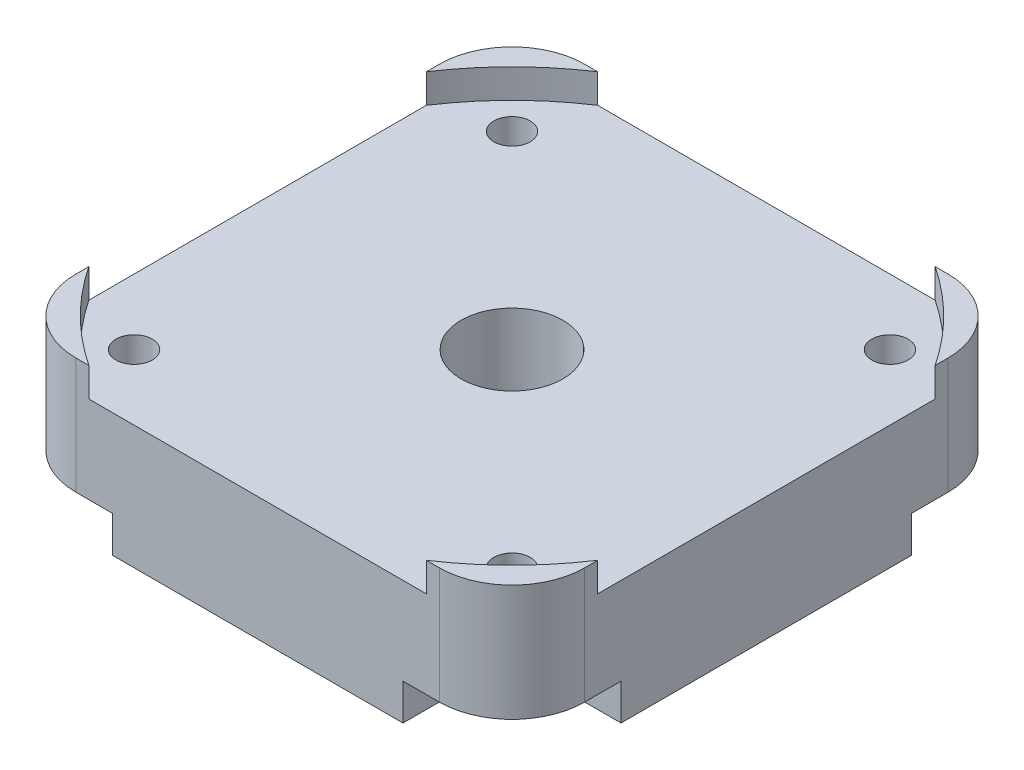
ISO-10303-21;
HEADER;
FILE_DESCRIPTION(('STEP AP214'),'2;1');
FILE_NAME('part.step','',(''),(''),'','','');
FILE_SCHEMA(('AUTOMOTIVE_DESIGN { 1 0 10303 214 1 1 1 1 }'));
ENDSEC;
DATA;
#1=APPLICATION_CONTEXT('core data for automotive mechanical design processes');
#2=APPLICATION_PROTOCOL_DEFINITION('international standard','automotive_design',2000,#1);
#3=PRODUCT_CONTEXT('',#1,'mechanical');
#4=PRODUCT('Part','Part','',(#3));
#5=PRODUCT_RELATED_PRODUCT_CATEGORY('part','',(#4));
#6=PRODUCT_DEFINITION_FORMATION('','',#4);
#7=PRODUCT_DEFINITION_CONTEXT('part definition',#1,'design');
#8=PRODUCT_DEFINITION('design','',#6,#7);
#9=PRODUCT_DEFINITION_SHAPE('','',#8);
#10=(LENGTH_UNIT() NAMED_UNIT(*) SI_UNIT(.MILLI.,.METRE.));
#11=(NAMED_UNIT(*) PLANE_ANGLE_UNIT() SI_UNIT($,.RADIAN.));
#12=(NAMED_UNIT(*) SI_UNIT($,.STERADIAN.) SOLID_ANGLE_UNIT());
#13=UNCERTAINTY_MEASURE_WITH_UNIT(LENGTH_MEASURE(1.E-05),#10,'distance_accuracy_value','');
#14=(GEOMETRIC_REPRESENTATION_CONTEXT(3) GLOBAL_UNCERTAINTY_ASSIGNED_CONTEXT((#13)) GLOBAL_UNIT_ASSIGNED_CONTEXT((#10,
#11,#12)) REPRESENTATION_CONTEXT('',''));
#15=CARTESIAN_POINT('',(0.,0.,0.));
#16=DIRECTION('',(0.,0.,1.));
#17=DIRECTION('',(1.,0.,0.));
#18=AXIS2_PLACEMENT_3D('',#15,#16,#17);
#19=CARTESIAN_POINT('',(0.,0.,0.));
#20=DIRECTION('',(0.,1.,0.));
#21=DIRECTION('',(1.,0.,0.));
#22=AXIS2_PLACEMENT_3D('',#19,#20,#21);
#23=PLANE('',#22);
#24=DIRECTION('',(1.,0.,0.));
#25=VECTOR('',#24,1.);
#26=CARTESIAN_POINT('',(-10.,0.,17.5));
#27=LINE('',#26,#25);
#28=CARTESIAN_POINT('',(-10.,0.,17.5));
#29=VERTEX_POINT('',#28);
#30=CARTESIAN_POINT('',(10.,0.,17.5));
#31=VERTEX_POINT('',#30);
#32=EDGE_CURVE('E35',#29,#31,#27,.T.);
#33=ORIENTED_EDGE('',*,*,#32,.F.);
#34=DIRECTION('',(0.,0.,-1.));
#35=VECTOR('',#34,1.);
#36=CARTESIAN_POINT('',(-10.,0.,17.5));
#37=LINE('',#36,#35);
#38=CARTESIAN_POINT('',(-10.,0.,10.));
#39=VERTEX_POINT('',#38);
#40=EDGE_CURVE('E11',#29,#39,#37,.T.);
#41=ORIENTED_EDGE('',*,*,#40,.T.);
#42=DIRECTION('',(1.,0.,0.));
#43=VECTOR('',#42,1.);
#44=CARTESIAN_POINT('',(-17.5,0.,10.));
#45=LINE('',#44,#43);
#46=CARTESIAN_POINT('',(-17.5,0.,10.));
#47=VERTEX_POINT('',#46);
#48=EDGE_CURVE('E304',#47,#39,#45,.T.);
#49=ORIENTED_EDGE('',*,*,#48,.F.);
#50=DIRECTION('',(0.,0.,1.));
#51=VECTOR('',#50,1.);
#52=CARTESIAN_POINT('',(-17.5,0.,-10.));
#53=LINE('',#52,#51);
#54=CARTESIAN_POINT('',(-17.5,0.,-10.));
#55=VERTEX_POINT('',#54);
#56=EDGE_CURVE('E327',#55,#47,#53,.T.);
#57=ORIENTED_EDGE('',*,*,#56,.F.);
#58=DIRECTION('',(1.,0.,0.));
#59=VECTOR('',#58,1.);
#60=CARTESIAN_POINT('',(-17.5,0.,-10.));
#61=LINE('',#60,#59);
#62=CARTESIAN_POINT('',(-10.,0.,-10.));
#63=VERTEX_POINT('',#62);
#64=EDGE_CURVE('E27',#55,#63,#61,.T.);
#65=ORIENTED_EDGE('',*,*,#64,.T.);
#66=DIRECTION('',(0.,0.,1.));
#67=VECTOR('',#66,1.);
#68=CARTESIAN_POINT('',(-10.,0.,-17.5));
#69=LINE('',#68,#67);
#70=CARTESIAN_POINT('',(-10.,0.,-17.5));
#71=VERTEX_POINT('',#70);
#72=EDGE_CURVE('E255',#71,#63,#69,.T.);
#73=ORIENTED_EDGE('',*,*,#72,.F.);
#74=DIRECTION('',(-1.,0.,0.));
#75=VECTOR('',#74,1.);
#76=CARTESIAN_POINT('',(10.,0.,-17.5));
#77=LINE('',#76,#75);
#78=CARTESIAN_POINT('',(10.,0.,-17.5));
#79=VERTEX_POINT('',#78);
#80=EDGE_CURVE('E258',#79,#71,#77,.T.);
#81=ORIENTED_EDGE('',*,*,#80,.F.);
#82=DIRECTION('',(0.,0.,1.));
#83=VECTOR('',#82,1.);
#84=CARTESIAN_POINT('',(10.,0.,-17.5));
#85=LINE('',#84,#83);
#86=CARTESIAN_POINT('',(10.,0.,-10.));
#87=VERTEX_POINT('',#86);
#88=EDGE_CURVE('E445',#79,#87,#85,.T.);
#89=ORIENTED_EDGE('',*,*,#88,.T.);
#90=DIRECTION('',(-1.,0.,0.));
#91=VECTOR('',#90,1.);
#92=CARTESIAN_POINT('',(17.5,0.,-10.));
#93=LINE('',#92,#91);
#94=CARTESIAN_POINT('',(17.5,0.,-10.));
#95=VERTEX_POINT('',#94);
#96=EDGE_CURVE('E249',#95,#87,#93,.T.);
#97=ORIENTED_EDGE('',*,*,#96,.F.);
#98=DIRECTION('',(0.,0.,-1.));
#99=VECTOR('',#98,1.);
#100=CARTESIAN_POINT('',(17.5,0.,10.));
#101=LINE('',#100,#99);
#102=CARTESIAN_POINT('',(17.5,0.,10.));
#103=VERTEX_POINT('',#102);
#104=EDGE_CURVE('E244',#103,#95,#101,.T.);
#105=ORIENTED_EDGE('',*,*,#104,.F.);
#106=DIRECTION('',(-1.,0.,0.));
#107=VECTOR('',#106,1.);
#108=CARTESIAN_POINT('',(17.5,0.,10.));
#109=LINE('',#108,#107);
#110=CARTESIAN_POINT('',(10.,0.,10.));
#111=VERTEX_POINT('',#110);
#112=EDGE_CURVE('E441',#103,#111,#109,.T.);
#113=ORIENTED_EDGE('',*,*,#112,.T.);
#114=DIRECTION('',(0.,0.,-1.));
#115=VECTOR('',#114,1.);
#116=CARTESIAN_POINT('',(10.,0.,17.5));
#117=LINE('',#116,#115);
#118=EDGE_CURVE('E428',#31,#111,#117,.T.);
#119=ORIENTED_EDGE('',*,*,#118,.F.);
#120=EDGE_LOOP('',(#33,#41,#49,#57,#65,#73,#81,#89,#97,#105,#113,#119));
#121=FACE_BOUND('',#120,.T.);
#122=CARTESIAN_POINT('',(0.,0.,0.));
#123=DIRECTION('',(0.,1.,0.));
#124=DIRECTION('',(1.,0.,0.));
#125=AXIS2_PLACEMENT_3D('',#122,#123,#124);
#126=CIRCLE('',#125,3.5);
#127=CARTESIAN_POINT('',(3.5,0.,0.));
#128=VERTEX_POINT('',#127);
#129=EDGE_CURVE('E438',#128,#128,#126,.T.);
#130=ORIENTED_EDGE('',*,*,#129,.T.);
#131=EDGE_LOOP('',(#130));
#132=FACE_BOUND('',#131,.T.);
#133=ADVANCED_FACE('F17',(#121,#132),#23,.F.);
#134=CARTESIAN_POINT('',(10.,0.,17.5));
#135=DIRECTION('',(-1.,0.,0.));
#136=DIRECTION('',(0.,0.,-1.));
#137=AXIS2_PLACEMENT_3D('',#134,#135,#136);
#138=PLANE('',#137);
#139=DIRECTION('',(0.,1.,0.));
#140=VECTOR('',#139,1.);
#141=CARTESIAN_POINT('',(10.,0.,10.));
#142=LINE('',#141,#140);
#143=CARTESIAN_POINT('',(10.,2.5,10.));
#144=VERTEX_POINT('',#143);
#145=EDGE_CURVE('E435',#111,#144,#142,.T.);
#146=ORIENTED_EDGE('',*,*,#145,.T.);
#147=DIRECTION('',(0.,0.,-1.));
#148=VECTOR('',#147,1.);
#149=CARTESIAN_POINT('',(10.,2.5,17.5));
#150=LINE('',#149,#148);
#151=CARTESIAN_POINT('',(10.,2.5,17.5));
#152=VERTEX_POINT('',#151);
#153=EDGE_CURVE('E411',#152,#144,#150,.T.);
#154=ORIENTED_EDGE('',*,*,#153,.F.);
#155=DIRECTION('',(0.,1.,0.));
#156=VECTOR('',#155,1.);
#157=CARTESIAN_POINT('',(10.,0.,17.5));
#158=LINE('',#157,#156);
#159=EDGE_CURVE('E431',#31,#152,#158,.T.);
#160=ORIENTED_EDGE('',*,*,#159,.F.);
#161=ORIENTED_EDGE('',*,*,#118,.T.);
#162=EDGE_LOOP('',(#146,#154,#160,#161));
#163=FACE_BOUND('',#162,.T.);
#164=ADVANCED_FACE('F468',(#163),#138,.F.);
#165=CARTESIAN_POINT('',(-17.5,0.,17.5));
#166=DIRECTION('',(0.,0.,1.));
#167=DIRECTION('',(1.,0.,0.));
#168=AXIS2_PLACEMENT_3D('',#165,#166,#167);
#169=PLANE('',#168);
#170=DIRECTION('',(0.,-1.,0.));
#171=VECTOR('',#170,1.);
#172=CARTESIAN_POINT('',(12.5,10.5,17.5));
#173=LINE('',#172,#171);
#174=CARTESIAN_POINT('',(12.5,10.5,17.5));
#175=VERTEX_POINT('',#174);
#176=CARTESIAN_POINT('',(12.5,2.5,17.5));
#177=VERTEX_POINT('',#176);
#178=EDGE_CURVE('E394',#175,#177,#173,.T.);
#179=ORIENTED_EDGE('',*,*,#178,.F.);
#180=DIRECTION('',(1.,0.,0.));
#181=VECTOR('',#180,1.);
#182=CARTESIAN_POINT('',(11.60818676624,10.5,17.5));
#183=LINE('',#182,#181);
#184=CARTESIAN_POINT('',(11.60818676624,10.5,17.5));
#185=VERTEX_POINT('',#184);
#186=EDGE_CURVE('E371',#185,#175,#183,.T.);
#187=ORIENTED_EDGE('',*,*,#186,.F.);
#188=DIRECTION('',(0.,-1.,0.));
#189=VECTOR('',#188,1.);
#190=CARTESIAN_POINT('',(11.60818676624,10.5,17.5));
#191=LINE('',#190,#189);
#192=CARTESIAN_POINT('',(11.60818676624,8.5,17.5));
#193=VERTEX_POINT('',#192);
#194=EDGE_CURVE('E421',#185,#193,#191,.T.);
#195=ORIENTED_EDGE('',*,*,#194,.T.);
#196=DIRECTION('',(1.,0.,0.));
#197=VECTOR('',#196,1.);
#198=CARTESIAN_POINT('',(-11.60818676624,8.5,17.5));
#199=LINE('',#198,#197);
#200=CARTESIAN_POINT('',(-11.60818676624,8.5,17.5));
#201=VERTEX_POINT('',#200);
#202=EDGE_CURVE('E295',#201,#193,#199,.T.);
#203=ORIENTED_EDGE('',*,*,#202,.F.);
#204=DIRECTION('',(0.,-1.,0.));
#205=VECTOR('',#204,1.);
#206=CARTESIAN_POINT('',(-11.60818676624,10.5,17.5));
#207=LINE('',#206,#205);
#208=CARTESIAN_POINT('',(-11.60818676624,10.5,17.5));
#209=VERTEX_POINT('',#208);
#210=EDGE_CURVE('E298',#209,#201,#207,.T.);
#211=ORIENTED_EDGE('',*,*,#210,.F.);
#212=DIRECTION('',(1.,0.,0.));
#213=VECTOR('',#212,1.);
#214=CARTESIAN_POINT('',(-12.5,10.5,17.5));
#215=LINE('',#214,#213);
#216=CARTESIAN_POINT('',(-12.5,10.5,17.5));
#217=VERTEX_POINT('',#216);
#218=EDGE_CURVE('E366',#217,#209,#215,.T.);
#219=ORIENTED_EDGE('',*,*,#218,.F.);
#220=DIRECTION('',(0.,-1.,0.));
#221=VECTOR('',#220,1.);
#222=CARTESIAN_POINT('',(-12.5,10.5,17.5));
#223=LINE('',#222,#221);
#224=CARTESIAN_POINT('',(-12.5,2.5,17.5));
#225=VERTEX_POINT('',#224);
#226=EDGE_CURVE('E418',#217,#225,#223,.T.);
#227=ORIENTED_EDGE('',*,*,#226,.T.);
#228=DIRECTION('',(1.,0.,0.));
#229=VECTOR('',#228,1.);
#230=CARTESIAN_POINT('',(-12.5,2.5,17.5));
#231=LINE('',#230,#229);
#232=CARTESIAN_POINT('',(-10.,2.5,17.5));
#233=VERTEX_POINT('',#232);
#234=EDGE_CURVE('E415',#225,#233,#231,.T.);
#235=ORIENTED_EDGE('',*,*,#234,.T.);
#236=DIRECTION('',(0.,1.,0.));
#237=VECTOR('',#236,1.);
#238=CARTESIAN_POINT('',(-10.,0.,17.5));
#239=LINE('',#238,#237);
#240=EDGE_CURVE('E308',#29,#233,#239,.T.);
#241=ORIENTED_EDGE('',*,*,#240,.F.);
#242=ORIENTED_EDGE('',*,*,#32,.T.);
#243=ORIENTED_EDGE('',*,*,#159,.T.);
#244=DIRECTION('',(-1.,0.,0.));
#245=VECTOR('',#244,1.);
#246=CARTESIAN_POINT('',(12.5,2.5,17.5));
#247=LINE('',#246,#245);
#248=EDGE_CURVE('E403',#177,#152,#247,.T.);
#249=ORIENTED_EDGE('',*,*,#248,.F.);
#250=EDGE_LOOP('',(#179,#187,#195,#203,#211,#219,#227,#235,#241,#242,#243,#249));
#251=FACE_BOUND('',#250,.T.);
#252=ADVANCED_FACE('F461',(#251),#169,.T.);
#253=CARTESIAN_POINT('',(0.,2.5,0.));
#254=DIRECTION('',(0.,-1.,0.));
#255=DIRECTION('',(0.,0.,-1.));
#256=AXIS2_PLACEMENT_3D('',#253,#254,#255);
#257=PLANE('',#256);
#258=ORIENTED_EDGE('',*,*,#153,.T.);
#259=DIRECTION('',(1.,0.,0.));
#260=VECTOR('',#259,1.);
#261=CARTESIAN_POINT('',(10.,2.5,10.));
#262=LINE('',#261,#260);
#263=CARTESIAN_POINT('',(17.5,2.5,10.));
#264=VERTEX_POINT('',#263);
#265=EDGE_CURVE('E407',#144,#264,#262,.T.);
#266=ORIENTED_EDGE('',*,*,#265,.T.);
#267=DIRECTION('',(0.,0.,-1.));
#268=VECTOR('',#267,1.);
#269=CARTESIAN_POINT('',(17.5,2.5,12.5));
#270=LINE('',#269,#268);
#271=CARTESIAN_POINT('',(17.5,2.5,12.5));
#272=VERTEX_POINT('',#271);
#273=EDGE_CURVE('E235',#272,#264,#270,.T.);
#274=ORIENTED_EDGE('',*,*,#273,.F.);
#275=CARTESIAN_POINT('',(12.5,2.5,12.5));
#276=DIRECTION('',(0.,-1.,0.));
#277=DIRECTION('',(1.,0.,0.));
#278=AXIS2_PLACEMENT_3D('',#275,#276,#277);
#279=CIRCLE('',#278,5.);
#280=EDGE_CURVE('E404',#272,#177,#279,.T.);
#281=ORIENTED_EDGE('',*,*,#280,.T.);
#282=ORIENTED_EDGE('',*,*,#248,.T.);
#283=EDGE_LOOP('',(#258,#266,#274,#281,#282));
#284=FACE_BOUND('',#283,.T.);
#285=CARTESIAN_POINT('',(13.,2.5,13.));
#286=DIRECTION('',(0.,1.,0.));
#287=DIRECTION('',(-1.,0.,0.));
#288=AXIS2_PLACEMENT_3D('',#285,#286,#287);
#289=CIRCLE('',#288,1.25);
#290=CARTESIAN_POINT('',(11.75,2.5,13.));
#291=VERTEX_POINT('',#290);
#292=EDGE_CURVE('E400',#291,#291,#289,.T.);
#293=ORIENTED_EDGE('',*,*,#292,.T.);
#294=EDGE_LOOP('',(#293));
#295=FACE_BOUND('',#294,.T.);
#296=ADVANCED_FACE('F471',(#284,#295),#257,.T.);
#297=CARTESIAN_POINT('',(12.5,24.1878,12.5));
#298=DIRECTION('',(0.,-1.,0.));
#299=DIRECTION('',(1.,0.,0.));
#300=AXIS2_PLACEMENT_3D('',#297,#298,#299);
#301=CYLINDRICAL_SURFACE('',#300,5.);
#302=DIRECTION('',(0.,-1.,0.));
#303=VECTOR('',#302,1.);
#304=CARTESIAN_POINT('',(17.5,10.5,12.5));
#305=LINE('',#304,#303);
#306=CARTESIAN_POINT('',(17.5,10.5,12.5));
#307=VERTEX_POINT('',#306);
#308=EDGE_CURVE('E267',#307,#272,#305,.T.);
#309=ORIENTED_EDGE('',*,*,#308,.F.);
#310=CARTESIAN_POINT('',(12.5,10.5,12.5));
#311=DIRECTION('',(0.,1.,0.));
#312=DIRECTION('',(0.,0.,1.));
#313=AXIS2_PLACEMENT_3D('',#310,#311,#312);
#314=CIRCLE('',#313,5.);
#315=EDGE_CURVE('E395',#175,#307,#314,.T.);
#316=ORIENTED_EDGE('',*,*,#315,.F.);
#317=ORIENTED_EDGE('',*,*,#178,.T.);
#318=ORIENTED_EDGE('',*,*,#280,.F.);
#319=EDGE_LOOP('',(#309,#316,#317,#318));
#320=FACE_BOUND('',#319,.T.);
#321=ADVANCED_FACE('F477',(#320),#301,.T.);
#322=CARTESIAN_POINT('',(0.,10.5,0.));
#323=DIRECTION('',(0.,1.,0.));
#324=DIRECTION('',(1.,0.,0.));
#325=AXIS2_PLACEMENT_3D('',#322,#323,#324);
#326=PLANE('',#325);
#327=DIRECTION('',(0.,0.,1.));
#328=VECTOR('',#327,1.);
#329=CARTESIAN_POINT('',(-17.5,10.5,-12.5));
#330=LINE('',#329,#328);
#331=CARTESIAN_POINT('',(-17.5,10.5,-12.5));
#332=VERTEX_POINT('',#331);
#333=CARTESIAN_POINT('',(-17.5,10.5,-11.60818676624));
#334=VERTEX_POINT('',#333);
#335=EDGE_CURVE('E391',#332,#334,#330,.T.);
#336=ORIENTED_EDGE('',*,*,#335,.T.);
#337=CARTESIAN_POINT('',(0.,10.5,0.));
#338=DIRECTION('',(0.,-1.,0.));
#339=DIRECTION('',(-0.833333333333308,0.,-0.552770798392605));
#340=AXIS2_PLACEMENT_3D('',#337,#338,#339);
#341=CIRCLE('',#340,21.);
#342=CARTESIAN_POINT('',(-11.60818676624,10.5,-17.5));
#343=VERTEX_POINT('',#342);
#344=EDGE_CURVE('E388',#334,#343,#341,.T.);
#345=ORIENTED_EDGE('',*,*,#344,.T.);
#346=DIRECTION('',(-1.,0.,0.));
#347=VECTOR('',#346,1.);
#348=CARTESIAN_POINT('',(-11.60818676624,10.5,-17.5));
#349=LINE('',#348,#347);
#350=CARTESIAN_POINT('',(-12.5,10.5,-17.5));
#351=VERTEX_POINT('',#350);
#352=EDGE_CURVE('E385',#343,#351,#349,.T.);
#353=ORIENTED_EDGE('',*,*,#352,.T.);
#354=CARTESIAN_POINT('',(-12.5,10.5,-12.5));
#355=DIRECTION('',(0.,1.,0.));
#356=DIRECTION('',(0.,0.,-1.));
#357=AXIS2_PLACEMENT_3D('',#354,#355,#356);
#358=CIRCLE('',#357,5.);
#359=EDGE_CURVE('E383',#351,#332,#358,.T.);
#360=ORIENTED_EDGE('',*,*,#359,.T.);
#361=EDGE_LOOP('',(#336,#345,#353,#360));
#362=FACE_BOUND('',#361,.T.);
#363=ADVANCED_FACE('F542',(#362),#326,.T.);
#364=CARTESIAN_POINT('',(0.,10.5,0.));
#365=DIRECTION('',(0.,1.,0.));
#366=DIRECTION('',(1.,0.,0.));
#367=AXIS2_PLACEMENT_3D('',#364,#365,#366);
#368=PLANE('',#367);
#369=DIRECTION('',(-1.,0.,0.));
#370=VECTOR('',#369,1.);
#371=CARTESIAN_POINT('',(12.5,10.5,-17.5));
#372=LINE('',#371,#370);
#373=CARTESIAN_POINT('',(12.5,10.5,-17.5));
#374=VERTEX_POINT('',#373);
#375=CARTESIAN_POINT('',(11.60818676624,10.5,-17.5));
#376=VERTEX_POINT('',#375);
#377=EDGE_CURVE('E380',#374,#376,#372,.T.);
#378=ORIENTED_EDGE('',*,*,#377,.T.);
#379=CARTESIAN_POINT('',(0.,10.5,0.));
#380=DIRECTION('',(0.,-1.,0.));
#381=DIRECTION('',(0.552770798392605,0.,-0.833333333333308));
#382=AXIS2_PLACEMENT_3D('',#379,#380,#381);
#383=CIRCLE('',#382,21.);
#384=CARTESIAN_POINT('',(17.5,10.5,-11.60818676624));
#385=VERTEX_POINT('',#384);
#386=EDGE_CURVE('E377',#376,#385,#383,.T.);
#387=ORIENTED_EDGE('',*,*,#386,.T.);
#388=DIRECTION('',(0.,0.,-1.));
#389=VECTOR('',#388,1.);
#390=CARTESIAN_POINT('',(17.5,10.5,-11.60818676624));
#391=LINE('',#390,#389);
#392=CARTESIAN_POINT('',(17.5,10.5,-12.5));
#393=VERTEX_POINT('',#392);
#394=EDGE_CURVE('E375',#385,#393,#391,.T.);
#395=ORIENTED_EDGE('',*,*,#394,.T.);
#396=CARTESIAN_POINT('',(12.5,10.5,-12.5));
#397=DIRECTION('',(0.,1.,0.));
#398=DIRECTION('',(1.,0.,0.));
#399=AXIS2_PLACEMENT_3D('',#396,#397,#398);
#400=CIRCLE('',#399,5.);
#401=EDGE_CURVE('E220',#393,#374,#400,.T.);
#402=ORIENTED_EDGE('',*,*,#401,.T.);
#403=EDGE_LOOP('',(#378,#387,#395,#402));
#404=FACE_BOUND('',#403,.T.);
#405=ADVANCED_FACE('F545',(#404),#368,.T.);
#406=CARTESIAN_POINT('',(0.,10.5,0.));
#407=DIRECTION('',(0.,1.,0.));
#408=DIRECTION('',(1.,0.,0.));
#409=AXIS2_PLACEMENT_3D('',#406,#407,#408);
#410=PLANE('',#409);
#411=DIRECTION('',(0.,0.,-1.));
#412=VECTOR('',#411,1.);
#413=CARTESIAN_POINT('',(17.5,10.5,12.5));
#414=LINE('',#413,#412);
#415=CARTESIAN_POINT('',(17.5,10.5,11.60818676624));
#416=VERTEX_POINT('',#415);
#417=EDGE_CURVE('E370',#307,#416,#414,.T.);
#418=ORIENTED_EDGE('',*,*,#417,.T.);
#419=CARTESIAN_POINT('',(0.,10.5,0.));
#420=DIRECTION('',(0.,-1.,0.));
#421=DIRECTION('',(0.833333333333308,0.,0.552770798392605));
#422=AXIS2_PLACEMENT_3D('',#419,#420,#421);
#423=CIRCLE('',#422,21.);
#424=EDGE_CURVE('E367',#416,#185,#423,.T.);
#425=ORIENTED_EDGE('',*,*,#424,.T.);
#426=ORIENTED_EDGE('',*,*,#186,.T.);
#427=ORIENTED_EDGE('',*,*,#315,.T.);
#428=EDGE_LOOP('',(#418,#425,#426,#427));
#429=FACE_BOUND('',#428,.T.);
#430=ADVANCED_FACE('F480',(#429),#410,.T.);
#431=CARTESIAN_POINT('',(0.,10.5,0.));
#432=DIRECTION('',(0.,1.,0.));
#433=DIRECTION('',(1.,0.,0.));
#434=AXIS2_PLACEMENT_3D('',#431,#432,#433);
#435=PLANE('',#434);
#436=ORIENTED_EDGE('',*,*,#218,.T.);
#437=CARTESIAN_POINT('',(0.,10.5,0.));
#438=DIRECTION('',(0.,-1.,0.));
#439=DIRECTION('',(-0.552770798392605,0.,0.833333333333308));
#440=AXIS2_PLACEMENT_3D('',#437,#438,#439);
#441=CIRCLE('',#440,21.);
#442=CARTESIAN_POINT('',(-17.5,10.5,11.60818676624));
#443=VERTEX_POINT('',#442);
#444=EDGE_CURVE('E363',#209,#443,#441,.T.);
#445=ORIENTED_EDGE('',*,*,#444,.T.);
#446=DIRECTION('',(0.,0.,1.));
#447=VECTOR('',#446,1.);
#448=CARTESIAN_POINT('',(-17.5,10.5,11.60818676624));
#449=LINE('',#448,#447);
#450=CARTESIAN_POINT('',(-17.5,10.5,12.5));
#451=VERTEX_POINT('',#450);
#452=EDGE_CURVE('E360',#443,#451,#449,.T.);
#453=ORIENTED_EDGE('',*,*,#452,.T.);
#454=CARTESIAN_POINT('',(-12.5,10.5,12.5));
#455=DIRECTION('',(0.,1.,0.));
#456=DIRECTION('',(-1.,0.,0.));
#457=AXIS2_PLACEMENT_3D('',#454,#455,#456);
#458=CIRCLE('',#457,5.);
#459=EDGE_CURVE('E356',#451,#217,#458,.T.);
#460=ORIENTED_EDGE('',*,*,#459,.T.);
#461=EDGE_LOOP('',(#436,#445,#453,#460));
#462=FACE_BOUND('',#461,.T.);
#463=ADVANCED_FACE('F497',(#462),#435,.T.);
#464=CARTESIAN_POINT('',(-12.5,24.1878,-12.5));
#465=DIRECTION('',(0.,-1.,0.));
#466=DIRECTION('',(-1.,0.,0.));
#467=AXIS2_PLACEMENT_3D('',#464,#465,#466);
#468=CYLINDRICAL_SURFACE('',#467,5.);
#469=DIRECTION('',(0.,-1.,0.));
#470=VECTOR('',#469,1.);
#471=CARTESIAN_POINT('',(-17.5,10.5,-12.5));
#472=LINE('',#471,#470);
#473=CARTESIAN_POINT('',(-17.5,2.5,-12.5));
#474=VERTEX_POINT('',#473);
#475=EDGE_CURVE('E336',#332,#474,#472,.T.);
#476=ORIENTED_EDGE('',*,*,#475,.F.);
#477=ORIENTED_EDGE('',*,*,#359,.F.);
#478=DIRECTION('',(0.,-1.,0.));
#479=VECTOR('',#478,1.);
#480=CARTESIAN_POINT('',(-12.5,10.5,-17.5));
#481=LINE('',#480,#479);
#482=CARTESIAN_POINT('',(-12.5,2.5,-17.5));
#483=VERTEX_POINT('',#482);
#484=EDGE_CURVE('E353',#351,#483,#481,.T.);
#485=ORIENTED_EDGE('',*,*,#484,.T.);
#486=CARTESIAN_POINT('',(-12.5,2.5,-12.5));
#487=DIRECTION('',(0.,-1.,0.));
#488=DIRECTION('',(-1.,0.,0.));
#489=AXIS2_PLACEMENT_3D('',#486,#487,#488);
#490=CIRCLE('',#489,5.);
#491=EDGE_CURVE('E351',#474,#483,#490,.T.);
#492=ORIENTED_EDGE('',*,*,#491,.F.);
#493=EDGE_LOOP('',(#476,#477,#485,#492));
#494=FACE_BOUND('',#493,.T.);
#495=ADVANCED_FACE('F554',(#494),#468,.T.);
#496=CARTESIAN_POINT('',(0.,2.5,0.));
#497=DIRECTION('',(0.,-1.,0.));
#498=DIRECTION('',(0.,0.,1.));
#499=AXIS2_PLACEMENT_3D('',#496,#497,#498);
#500=PLANE('',#499);
#501=ORIENTED_EDGE('',*,*,#491,.T.);
#502=DIRECTION('',(1.,0.,0.));
#503=VECTOR('',#502,1.);
#504=CARTESIAN_POINT('',(-12.5,2.5,-17.5));
#505=LINE('',#504,#503);
#506=CARTESIAN_POINT('',(-10.,2.5,-17.5));
#507=VERTEX_POINT('',#506);
#508=EDGE_CURVE('E348',#483,#507,#505,.T.);
#509=ORIENTED_EDGE('',*,*,#508,.T.);
#510=DIRECTION('',(0.,0.,1.));
#511=VECTOR('',#510,1.);
#512=CARTESIAN_POINT('',(-10.,2.5,-17.5));
#513=LINE('',#512,#511);
#514=CARTESIAN_POINT('',(-10.,2.5,-10.));
#515=VERTEX_POINT('',#514);
#516=EDGE_CURVE('E345',#507,#515,#513,.T.);
#517=ORIENTED_EDGE('',*,*,#516,.T.);
#518=DIRECTION('',(-1.,0.,0.));
#519=VECTOR('',#518,1.);
#520=CARTESIAN_POINT('',(-10.,2.5,-10.));
#521=LINE('',#520,#519);
#522=CARTESIAN_POINT('',(-17.5,2.5,-10.));
#523=VERTEX_POINT('',#522);
#524=EDGE_CURVE('E340',#515,#523,#521,.T.);
#525=ORIENTED_EDGE('',*,*,#524,.T.);
#526=DIRECTION('',(0.,0.,1.));
#527=VECTOR('',#526,1.);
#528=CARTESIAN_POINT('',(-17.5,2.5,-12.5));
#529=LINE('',#528,#527);
#530=EDGE_CURVE('E341',#474,#523,#529,.T.);
#531=ORIENTED_EDGE('',*,*,#530,.F.);
#532=EDGE_LOOP('',(#501,#509,#517,#525,#531));
#533=FACE_BOUND('',#532,.T.);
#534=CARTESIAN_POINT('',(-13.,2.5,-13.));
#535=DIRECTION('',(0.,1.,0.));
#536=DIRECTION('',(1.,0.,0.));
#537=AXIS2_PLACEMENT_3D('',#534,#535,#536);
#538=CIRCLE('',#537,1.25);
#539=CARTESIAN_POINT('',(-11.75,2.5,-13.));
#540=VERTEX_POINT('',#539);
#541=EDGE_CURVE('E335',#540,#540,#538,.T.);
#542=ORIENTED_EDGE('',*,*,#541,.T.);
#543=EDGE_LOOP('',(#542));
#544=FACE_BOUND('',#543,.T.);
#545=ADVANCED_FACE('F557',(#533,#544),#500,.T.);
#546=CARTESIAN_POINT('',(-17.5,0.,-17.5));
#547=DIRECTION('',(-1.,0.,0.));
#548=DIRECTION('',(0.,0.,1.));
#549=AXIS2_PLACEMENT_3D('',#546,#547,#548);
#550=PLANE('',#549);
#551=DIRECTION('',(0.,-1.,0.));
#552=VECTOR('',#551,1.);
#553=CARTESIAN_POINT('',(-17.5,10.5,12.5));
#554=LINE('',#553,#552);
#555=CARTESIAN_POINT('',(-17.5,2.5,12.5));
#556=VERTEX_POINT('',#555);
#557=EDGE_CURVE('E313',#451,#556,#554,.T.);
#558=ORIENTED_EDGE('',*,*,#557,.F.);
#559=ORIENTED_EDGE('',*,*,#452,.F.);
#560=DIRECTION('',(0.,-1.,0.));
#561=VECTOR('',#560,1.);
#562=CARTESIAN_POINT('',(-17.5,10.5,11.60818676624));
#563=LINE('',#562,#561);
#564=CARTESIAN_POINT('',(-17.5,8.5,11.60818676624));
#565=VERTEX_POINT('',#564);
#566=EDGE_CURVE('E332',#443,#565,#563,.T.);
#567=ORIENTED_EDGE('',*,*,#566,.T.);
#568=DIRECTION('',(0.,0.,1.));
#569=VECTOR('',#568,1.);
#570=CARTESIAN_POINT('',(-17.5,8.5,-11.60818676624));
#571=LINE('',#570,#569);
#572=CARTESIAN_POINT('',(-17.5,8.5,-11.60818676624));
#573=VERTEX_POINT('',#572);
#574=EDGE_CURVE('E291',#573,#565,#571,.T.);
#575=ORIENTED_EDGE('',*,*,#574,.F.);
#576=DIRECTION('',(0.,-1.,0.));
#577=VECTOR('',#576,1.);
#578=CARTESIAN_POINT('',(-17.5,10.5,-11.60818676624));
#579=LINE('',#578,#577);
#580=EDGE_CURVE('E286',#334,#573,#579,.T.);
#581=ORIENTED_EDGE('',*,*,#580,.F.);
#582=ORIENTED_EDGE('',*,*,#335,.F.);
#583=ORIENTED_EDGE('',*,*,#475,.T.);
#584=ORIENTED_EDGE('',*,*,#530,.T.);
#585=DIRECTION('',(0.,1.,0.));
#586=VECTOR('',#585,1.);
#587=CARTESIAN_POINT('',(-17.5,0.,-10.));
#588=LINE('',#587,#586);
#589=EDGE_CURVE('E260',#55,#523,#588,.T.);
#590=ORIENTED_EDGE('',*,*,#589,.F.);
#591=ORIENTED_EDGE('',*,*,#56,.T.);
#592=DIRECTION('',(0.,1.,0.));
#593=VECTOR('',#592,1.);
#594=CARTESIAN_POINT('',(-17.5,0.,10.));
#595=LINE('',#594,#593);
#596=CARTESIAN_POINT('',(-17.5,2.5,10.));
#597=VERTEX_POINT('',#596);
#598=EDGE_CURVE('E323',#47,#597,#595,.T.);
#599=ORIENTED_EDGE('',*,*,#598,.T.);
#600=DIRECTION('',(0.,0.,-1.));
#601=VECTOR('',#600,1.);
#602=CARTESIAN_POINT('',(-17.5,2.5,12.5));
#603=LINE('',#602,#601);
#604=EDGE_CURVE('E312',#556,#597,#603,.T.);
#605=ORIENTED_EDGE('',*,*,#604,.F.);
#606=EDGE_LOOP('',(#558,#559,#567,#575,#581,#582,#583,#584,#590,#591,#599,#605));
#607=FACE_BOUND('',#606,.T.);
#608=ADVANCED_FACE('F516',(#607),#550,.T.);
#609=CARTESIAN_POINT('',(0.,2.5,0.));
#610=DIRECTION('',(0.,-1.,0.));
#611=DIRECTION('',(1.,0.,0.));
#612=AXIS2_PLACEMENT_3D('',#609,#610,#611);
#613=PLANE('',#612);
#614=DIRECTION('',(1.,0.,0.));
#615=VECTOR('',#614,1.);
#616=CARTESIAN_POINT('',(-17.5,2.5,10.));
#617=LINE('',#616,#615);
#618=CARTESIAN_POINT('',(-10.,2.5,10.));
#619=VERTEX_POINT('',#618);
#620=EDGE_CURVE('E320',#597,#619,#617,.T.);
#621=ORIENTED_EDGE('',*,*,#620,.T.);
#622=DIRECTION('',(0.,0.,1.));
#623=VECTOR('',#622,1.);
#624=CARTESIAN_POINT('',(-10.,2.5,10.));
#625=LINE('',#624,#623);
#626=EDGE_CURVE('E317',#619,#233,#625,.T.);
#627=ORIENTED_EDGE('',*,*,#626,.T.);
#628=ORIENTED_EDGE('',*,*,#234,.F.);
#629=CARTESIAN_POINT('',(-12.5,2.5,12.5));
#630=DIRECTION('',(0.,-1.,0.));
#631=DIRECTION('',(0.,0.,1.));
#632=AXIS2_PLACEMENT_3D('',#629,#630,#631);
#633=CIRCLE('',#632,5.);
#634=EDGE_CURVE('E314',#225,#556,#633,.T.);
#635=ORIENTED_EDGE('',*,*,#634,.T.);
#636=ORIENTED_EDGE('',*,*,#604,.T.);
#637=EDGE_LOOP('',(#621,#627,#628,#635,#636));
#638=FACE_BOUND('',#637,.T.);
#639=CARTESIAN_POINT('',(-13.,2.5,13.));
#640=DIRECTION('',(0.,1.,0.));
#641=DIRECTION('',(0.,0.,-1.));
#642=AXIS2_PLACEMENT_3D('',#639,#640,#641);
#643=CIRCLE('',#642,1.25);
#644=CARTESIAN_POINT('',(-13.,2.5,11.75));
#645=VERTEX_POINT('',#644);
#646=EDGE_CURVE('E309',#645,#645,#643,.T.);
#647=ORIENTED_EDGE('',*,*,#646,.T.);
#648=EDGE_LOOP('',(#647));
#649=FACE_BOUND('',#648,.T.);
#650=ADVANCED_FACE('F505',(#638,#649),#613,.T.);
#651=CARTESIAN_POINT('',(-12.5,24.1878,12.5));
#652=DIRECTION('',(0.,-1.,0.));
#653=DIRECTION('',(0.,0.,1.));
#654=AXIS2_PLACEMENT_3D('',#651,#652,#653);
#655=CYLINDRICAL_SURFACE('',#654,5.);
#656=ORIENTED_EDGE('',*,*,#226,.F.);
#657=ORIENTED_EDGE('',*,*,#459,.F.);
#658=ORIENTED_EDGE('',*,*,#557,.T.);
#659=ORIENTED_EDGE('',*,*,#634,.F.);
#660=EDGE_LOOP('',(#656,#657,#658,#659));
#661=FACE_BOUND('',#660,.T.);
#662=ADVANCED_FACE('F502',(#661),#655,.T.);
#663=CARTESIAN_POINT('',(-10.,0.,10.));
#664=DIRECTION('',(1.,0.,0.));
#665=DIRECTION('',(0.,0.,1.));
#666=AXIS2_PLACEMENT_3D('',#663,#664,#665);
#667=PLANE('',#666);
#668=ORIENTED_EDGE('',*,*,#240,.T.);
#669=ORIENTED_EDGE('',*,*,#626,.F.);
#670=DIRECTION('',(0.,1.,0.));
#671=VECTOR('',#670,1.);
#672=CARTESIAN_POINT('',(-10.,0.,10.));
#673=LINE('',#672,#671);
#674=EDGE_CURVE('E305',#39,#619,#673,.T.);
#675=ORIENTED_EDGE('',*,*,#674,.F.);
#676=ORIENTED_EDGE('',*,*,#40,.F.);
#677=EDGE_LOOP('',(#668,#669,#675,#676));
#678=FACE_BOUND('',#677,.T.);
#679=ADVANCED_FACE('F510',(#678),#667,.F.);
#680=CARTESIAN_POINT('',(-17.5,0.,10.));
#681=DIRECTION('',(0.,0.,-1.));
#682=DIRECTION('',(1.,0.,0.));
#683=AXIS2_PLACEMENT_3D('',#680,#681,#682);
#684=PLANE('',#683);
#685=ORIENTED_EDGE('',*,*,#674,.T.);
#686=ORIENTED_EDGE('',*,*,#620,.F.);
#687=ORIENTED_EDGE('',*,*,#598,.F.);
#688=ORIENTED_EDGE('',*,*,#48,.T.);
#689=EDGE_LOOP('',(#685,#686,#687,#688));
#690=FACE_BOUND('',#689,.T.);
#691=ADVANCED_FACE('F517',(#690),#684,.F.);
#692=CARTESIAN_POINT('',(-13.,0.,13.));
#693=DIRECTION('',(0.,1.,0.));
#694=DIRECTION('',(0.,0.,1.));
#695=AXIS2_PLACEMENT_3D('',#692,#693,#694);
#696=CYLINDRICAL_SURFACE('',#695,1.25);
#697=CARTESIAN_POINT('',(-13.,8.5,13.));
#698=DIRECTION('',(0.,1.,0.));
#699=DIRECTION('',(0.,0.,1.));
#700=AXIS2_PLACEMENT_3D('',#697,#698,#699);
#701=CIRCLE('',#700,1.25);
#702=CARTESIAN_POINT('',(-13.,8.5,14.25));
#703=VERTEX_POINT('',#702);
#704=EDGE_CURVE('E301',#703,#703,#701,.T.);
#705=ORIENTED_EDGE('',*,*,#704,.T.);
#706=EDGE_LOOP('',(#705));
#707=FACE_BOUND('',#706,.T.);
#708=ORIENTED_EDGE('',*,*,#646,.F.);
#709=EDGE_LOOP('',(#708));
#710=FACE_BOUND('',#709,.T.);
#711=ADVANCED_FACE('F519',(#707,#710),#696,.F.);
#712=CARTESIAN_POINT('',(0.,8.5,0.));
#713=DIRECTION('',(0.,-1.,0.));
#714=DIRECTION('',(1.,0.,0.));
#715=AXIS2_PLACEMENT_3D('',#712,#713,#714);
#716=PLANE('',#715);
#717=CARTESIAN_POINT('',(0.,8.5,0.));
#718=DIRECTION('',(0.,-1.,0.));
#719=DIRECTION('',(-0.552770798392605,0.,0.833333333333308));
#720=AXIS2_PLACEMENT_3D('',#717,#718,#719);
#721=CIRCLE('',#720,21.);
#722=EDGE_CURVE('E222',#201,#565,#721,.T.);
#723=ORIENTED_EDGE('',*,*,#722,.F.);
#724=ORIENTED_EDGE('',*,*,#202,.T.);
#725=CARTESIAN_POINT('',(0.,8.5,0.));
#726=DIRECTION('',(0.,-1.,0.));
#727=DIRECTION('',(0.833333333333308,0.,0.552770798392605));
#728=AXIS2_PLACEMENT_3D('',#725,#726,#727);
#729=CIRCLE('',#728,21.);
#730=CARTESIAN_POINT('',(17.5,8.5,11.60818676624));
#731=VERTEX_POINT('',#730);
#732=EDGE_CURVE('E236',#731,#193,#729,.T.);
#733=ORIENTED_EDGE('',*,*,#732,.F.);
#734=DIRECTION('',(0.,0.,-1.));
#735=VECTOR('',#734,1.);
#736=CARTESIAN_POINT('',(17.5,8.5,11.60818676624));
#737=LINE('',#736,#735);
#738=CARTESIAN_POINT('',(17.5,8.5,-11.60818676624));
#739=VERTEX_POINT('',#738);
#740=EDGE_CURVE('E290',#731,#739,#737,.T.);
#741=ORIENTED_EDGE('',*,*,#740,.T.);
#742=CARTESIAN_POINT('',(0.,8.5,0.));
#743=DIRECTION('',(0.,-1.,0.));
#744=DIRECTION('',(0.552770798392605,0.,-0.833333333333308));
#745=AXIS2_PLACEMENT_3D('',#742,#743,#744);
#746=CIRCLE('',#745,21.);
#747=CARTESIAN_POINT('',(11.60818676624,8.5,-17.5));
#748=VERTEX_POINT('',#747);
#749=EDGE_CURVE('E272',#748,#739,#746,.T.);
#750=ORIENTED_EDGE('',*,*,#749,.F.);
#751=DIRECTION('',(-1.,0.,0.));
#752=VECTOR('',#751,1.);
#753=CARTESIAN_POINT('',(11.60818676624,8.5,-17.5));
#754=LINE('',#753,#752);
#755=CARTESIAN_POINT('',(-11.60818676624,8.5,-17.5));
#756=VERTEX_POINT('',#755);
#757=EDGE_CURVE('E287',#748,#756,#754,.T.);
#758=ORIENTED_EDGE('',*,*,#757,.T.);
#759=CARTESIAN_POINT('',(0.,8.5,0.));
#760=DIRECTION('',(0.,-1.,0.));
#761=DIRECTION('',(-0.833333333333308,0.,-0.552770798392605));
#762=AXIS2_PLACEMENT_3D('',#759,#760,#761);
#763=CIRCLE('',#762,21.);
#764=EDGE_CURVE('E271',#573,#756,#763,.T.);
#765=ORIENTED_EDGE('',*,*,#764,.F.);
#766=ORIENTED_EDGE('',*,*,#574,.T.);
#767=EDGE_LOOP('',(#723,#724,#733,#741,#750,#758,#765,#766));
#768=FACE_BOUND('',#767,.T.);
#769=CARTESIAN_POINT('',(-13.,8.5,-13.));
#770=DIRECTION('',(0.,1.,0.));
#771=DIRECTION('',(1.,0.,0.));
#772=AXIS2_PLACEMENT_3D('',#769,#770,#771);
#773=CIRCLE('',#772,1.25);
#774=CARTESIAN_POINT('',(-11.75,8.5,-13.));
#775=VERTEX_POINT('',#774);
#776=EDGE_CURVE('E242',#775,#775,#773,.T.);
#777=ORIENTED_EDGE('',*,*,#776,.F.);
#778=EDGE_LOOP('',(#777));
#779=FACE_BOUND('',#778,.T.);
#780=ORIENTED_EDGE('',*,*,#704,.F.);
#781=EDGE_LOOP('',(#780));
#782=FACE_BOUND('',#781,.T.);
#783=CARTESIAN_POINT('',(13.,8.5,13.));
#784=DIRECTION('',(0.,1.,0.));
#785=DIRECTION('',(-1.,0.,0.));
#786=AXIS2_PLACEMENT_3D('',#783,#784,#785);
#787=CIRCLE('',#786,1.25);
#788=CARTESIAN_POINT('',(11.75,8.5,13.));
#789=VERTEX_POINT('',#788);
#790=EDGE_CURVE('E278',#789,#789,#787,.T.);
#791=ORIENTED_EDGE('',*,*,#790,.F.);
#792=EDGE_LOOP('',(#791));
#793=FACE_BOUND('',#792,.T.);
#794=CARTESIAN_POINT('',(13.,8.5,-13.));
#795=DIRECTION('',(0.,1.,0.));
#796=DIRECTION('',(0.,0.,1.));
#797=AXIS2_PLACEMENT_3D('',#794,#795,#796);
#798=CIRCLE('',#797,1.25);
#799=CARTESIAN_POINT('',(13.,8.5,-11.75));
#800=VERTEX_POINT('',#799);
#801=EDGE_CURVE('E241',#800,#800,#798,.T.);
#802=ORIENTED_EDGE('',*,*,#801,.F.);
#803=EDGE_LOOP('',(#802));
#804=FACE_BOUND('',#803,.T.);
#805=CARTESIAN_POINT('',(0.,8.5,0.));
#806=DIRECTION('',(0.,1.,0.));
#807=DIRECTION('',(1.,0.,0.));
#808=AXIS2_PLACEMENT_3D('',#805,#806,#807);
#809=CIRCLE('',#808,3.5);
#810=CARTESIAN_POINT('',(3.5,8.5,0.));
#811=VERTEX_POINT('',#810);
#812=EDGE_CURVE('E275',#811,#811,#809,.T.);
#813=ORIENTED_EDGE('',*,*,#812,.F.);
#814=EDGE_LOOP('',(#813));
#815=FACE_BOUND('',#814,.T.);
#816=ADVANCED_FACE('F488',(#768,#779,#782,#793,#804,#815),#716,.F.);
#817=CARTESIAN_POINT('',(0.,10.5,0.));
#818=DIRECTION('',(0.,-1.,0.));
#819=DIRECTION('',(1.,0.,0.));
#820=AXIS2_PLACEMENT_3D('',#817,#818,#819);
#821=CYLINDRICAL_SURFACE('',#820,21.);
#822=ORIENTED_EDGE('',*,*,#580,.T.);
#823=ORIENTED_EDGE('',*,*,#764,.T.);
#824=DIRECTION('',(0.,-1.,0.));
#825=VECTOR('',#824,1.);
#826=CARTESIAN_POINT('',(-11.60818676624,10.5,-17.5));
#827=LINE('',#826,#825);
#828=EDGE_CURVE('E264',#343,#756,#827,.T.);
#829=ORIENTED_EDGE('',*,*,#828,.F.);
#830=ORIENTED_EDGE('',*,*,#344,.F.);
#831=EDGE_LOOP('',(#822,#823,#829,#830));
#832=FACE_BOUND('',#831,.T.);
#833=ADVANCED_FACE('F599',(#832),#821,.F.);
#834=CARTESIAN_POINT('',(0.,10.5,0.));
#835=DIRECTION('',(0.,-1.,0.));
#836=DIRECTION('',(1.,0.,0.));
#837=AXIS2_PLACEMENT_3D('',#834,#835,#836);
#838=CYLINDRICAL_SURFACE('',#837,21.);
#839=DIRECTION('',(0.,-1.,0.));
#840=VECTOR('',#839,1.);
#841=CARTESIAN_POINT('',(11.60818676624,10.5,-17.5));
#842=LINE('',#841,#840);
#843=EDGE_CURVE('E268',#376,#748,#842,.T.);
#844=ORIENTED_EDGE('',*,*,#843,.T.);
#845=ORIENTED_EDGE('',*,*,#749,.T.);
#846=DIRECTION('',(0.,-1.,0.));
#847=VECTOR('',#846,1.);
#848=CARTESIAN_POINT('',(17.5,10.5,-11.60818676624));
#849=LINE('',#848,#847);
#850=EDGE_CURVE('E245',#385,#739,#849,.T.);
#851=ORIENTED_EDGE('',*,*,#850,.F.);
#852=ORIENTED_EDGE('',*,*,#386,.F.);
#853=EDGE_LOOP('',(#844,#845,#851,#852));
#854=FACE_BOUND('',#853,.T.);
#855=ADVANCED_FACE('F608',(#854),#838,.F.);
#856=CARTESIAN_POINT('',(17.5,0.,-17.5));
#857=DIRECTION('',(0.,0.,-1.));
#858=DIRECTION('',(-1.,0.,0.));
#859=AXIS2_PLACEMENT_3D('',#856,#857,#858);
#860=PLANE('',#859);
#861=ORIENTED_EDGE('',*,*,#484,.F.);
#862=ORIENTED_EDGE('',*,*,#352,.F.);
#863=ORIENTED_EDGE('',*,*,#828,.T.);
#864=ORIENTED_EDGE('',*,*,#757,.F.);
#865=ORIENTED_EDGE('',*,*,#843,.F.);
#866=ORIENTED_EDGE('',*,*,#377,.F.);
#867=DIRECTION('',(0.,-1.,0.));
#868=VECTOR('',#867,1.);
#869=CARTESIAN_POINT('',(12.5,10.5,-17.5));
#870=LINE('',#869,#868);
#871=CARTESIAN_POINT('',(12.5,2.5,-17.5));
#872=VERTEX_POINT('',#871);
#873=EDGE_CURVE('E262',#374,#872,#870,.T.);
#874=ORIENTED_EDGE('',*,*,#873,.T.);
#875=DIRECTION('',(-1.,0.,0.));
#876=VECTOR('',#875,1.);
#877=CARTESIAN_POINT('',(12.5,2.5,-17.5));
#878=LINE('',#877,#876);
#879=CARTESIAN_POINT('',(10.,2.5,-17.5));
#880=VERTEX_POINT('',#879);
#881=EDGE_CURVE('E228',#872,#880,#878,.T.);
#882=ORIENTED_EDGE('',*,*,#881,.T.);
#883=DIRECTION('',(0.,1.,0.));
#884=VECTOR('',#883,1.);
#885=CARTESIAN_POINT('',(10.,0.,-17.5));
#886=LINE('',#885,#884);
#887=EDGE_CURVE('E248',#79,#880,#886,.T.);
#888=ORIENTED_EDGE('',*,*,#887,.F.);
#889=ORIENTED_EDGE('',*,*,#80,.T.);
#890=DIRECTION('',(0.,1.,0.));
#891=VECTOR('',#890,1.);
#892=CARTESIAN_POINT('',(-10.,0.,-17.5));
#893=LINE('',#892,#891);
#894=EDGE_CURVE('E254',#71,#507,#893,.T.);
#895=ORIENTED_EDGE('',*,*,#894,.T.);
#896=ORIENTED_EDGE('',*,*,#508,.F.);
#897=EDGE_LOOP('',(#861,#862,#863,#864,#865,#866,#874,#882,#888,#889,#895,#896));
#898=FACE_BOUND('',#897,.T.);
#899=ADVANCED_FACE('F618',(#898),#860,.T.);
#900=CARTESIAN_POINT('',(-10.,0.,-17.5));
#901=DIRECTION('',(1.,0.,0.));
#902=DIRECTION('',(0.,0.,1.));
#903=AXIS2_PLACEMENT_3D('',#900,#901,#902);
#904=PLANE('',#903);
#905=DIRECTION('',(0.,1.,0.));
#906=VECTOR('',#905,1.);
#907=CARTESIAN_POINT('',(-10.,0.,-10.));
#908=LINE('',#907,#906);
#909=EDGE_CURVE('E251',#63,#515,#908,.T.);
#910=ORIENTED_EDGE('',*,*,#909,.T.);
#911=ORIENTED_EDGE('',*,*,#516,.F.);
#912=ORIENTED_EDGE('',*,*,#894,.F.);
#913=ORIENTED_EDGE('',*,*,#72,.T.);
#914=EDGE_LOOP('',(#910,#911,#912,#913));
#915=FACE_BOUND('',#914,.T.);
#916=ADVANCED_FACE('F628',(#915),#904,.F.);
#917=CARTESIAN_POINT('',(-10.,0.,-10.));
#918=DIRECTION('',(0.,0.,1.));
#919=DIRECTION('',(-1.,0.,0.));
#920=AXIS2_PLACEMENT_3D('',#917,#918,#919);
#921=PLANE('',#920);
#922=ORIENTED_EDGE('',*,*,#589,.T.);
#923=ORIENTED_EDGE('',*,*,#524,.F.);
#924=ORIENTED_EDGE('',*,*,#909,.F.);
#925=ORIENTED_EDGE('',*,*,#64,.F.);
#926=EDGE_LOOP('',(#922,#923,#924,#925));
#927=FACE_BOUND('',#926,.T.);
#928=ADVANCED_FACE('F638',(#927),#921,.F.);
#929=CARTESIAN_POINT('',(10.,0.,-10.));
#930=DIRECTION('',(-1.,0.,0.));
#931=DIRECTION('',(0.,0.,-1.));
#932=AXIS2_PLACEMENT_3D('',#929,#930,#931);
#933=PLANE('',#932);
#934=ORIENTED_EDGE('',*,*,#887,.T.);
#935=DIRECTION('',(0.,0.,-1.));
#936=VECTOR('',#935,1.);
#937=CARTESIAN_POINT('',(10.,2.5,-10.));
#938=LINE('',#937,#936);
#939=CARTESIAN_POINT('',(10.,2.5,-10.));
#940=VERTEX_POINT('',#939);
#941=EDGE_CURVE('E230',#940,#880,#938,.T.);
#942=ORIENTED_EDGE('',*,*,#941,.F.);
#943=DIRECTION('',(0.,1.,0.));
#944=VECTOR('',#943,1.);
#945=CARTESIAN_POINT('',(10.,0.,-10.));
#946=LINE('',#945,#944);
#947=EDGE_CURVE('E247',#87,#940,#946,.T.);
#948=ORIENTED_EDGE('',*,*,#947,.F.);
#949=ORIENTED_EDGE('',*,*,#88,.F.);
#950=EDGE_LOOP('',(#934,#942,#948,#949));
#951=FACE_BOUND('',#950,.T.);
#952=ADVANCED_FACE('F648',(#951),#933,.F.);
#953=CARTESIAN_POINT('',(17.5,0.,-10.));
#954=DIRECTION('',(0.,0.,1.));
#955=DIRECTION('',(-1.,0.,0.));
#956=AXIS2_PLACEMENT_3D('',#953,#954,#955);
#957=PLANE('',#956);
#958=ORIENTED_EDGE('',*,*,#947,.T.);
#959=DIRECTION('',(-1.,0.,0.));
#960=VECTOR('',#959,1.);
#961=CARTESIAN_POINT('',(17.5,2.5,-10.));
#962=LINE('',#961,#960);
#963=CARTESIAN_POINT('',(17.5,2.5,-10.));
#964=VERTEX_POINT('',#963);
#965=EDGE_CURVE('E200',#964,#940,#962,.T.);
#966=ORIENTED_EDGE('',*,*,#965,.F.);
#967=DIRECTION('',(0.,1.,0.));
#968=VECTOR('',#967,1.);
#969=CARTESIAN_POINT('',(17.5,0.,-10.));
#970=LINE('',#969,#968);
#971=EDGE_CURVE('E211',#95,#964,#970,.T.);
#972=ORIENTED_EDGE('',*,*,#971,.F.);
#973=ORIENTED_EDGE('',*,*,#96,.T.);
#974=EDGE_LOOP('',(#958,#966,#972,#973));
#975=FACE_BOUND('',#974,.T.);
#976=ADVANCED_FACE('F658',(#975),#957,.F.);
#977=CARTESIAN_POINT('',(17.5,0.,17.5));
#978=DIRECTION('',(1.,0.,0.));
#979=DIRECTION('',(0.,0.,-1.));
#980=AXIS2_PLACEMENT_3D('',#977,#978,#979);
#981=PLANE('',#980);
#982=DIRECTION('',(0.,1.,0.));
#983=VECTOR('',#982,1.);
#984=CARTESIAN_POINT('',(17.5,0.,10.));
#985=LINE('',#984,#983);
#986=EDGE_CURVE('E238',#103,#264,#985,.T.);
#987=ORIENTED_EDGE('',*,*,#986,.F.);
#988=ORIENTED_EDGE('',*,*,#104,.T.);
#989=ORIENTED_EDGE('',*,*,#971,.T.);
#990=DIRECTION('',(0.,0.,1.));
#991=VECTOR('',#990,1.);
#992=CARTESIAN_POINT('',(17.5,2.5,-12.5));
#993=LINE('',#992,#991);
#994=CARTESIAN_POINT('',(17.5,2.5,-12.5));
#995=VERTEX_POINT('',#994);
#996=EDGE_CURVE('E206',#995,#964,#993,.T.);
#997=ORIENTED_EDGE('',*,*,#996,.F.);
#998=DIRECTION('',(0.,-1.,0.));
#999=VECTOR('',#998,1.);
#1000=CARTESIAN_POINT('',(17.5,10.5,-12.5));
#1001=LINE('',#1000,#999);
#1002=EDGE_CURVE('E210',#393,#995,#1001,.T.);
#1003=ORIENTED_EDGE('',*,*,#1002,.F.);
#1004=ORIENTED_EDGE('',*,*,#394,.F.);
#1005=ORIENTED_EDGE('',*,*,#850,.T.);
#1006=ORIENTED_EDGE('',*,*,#740,.F.);
#1007=DIRECTION('',(0.,-1.,0.));
#1008=VECTOR('',#1007,1.);
#1009=CARTESIAN_POINT('',(17.5,10.5,11.60818676624));
#1010=LINE('',#1009,#1008);
#1011=EDGE_CURVE('E233',#416,#731,#1010,.T.);
#1012=ORIENTED_EDGE('',*,*,#1011,.F.);
#1013=ORIENTED_EDGE('',*,*,#417,.F.);
#1014=ORIENTED_EDGE('',*,*,#308,.T.);
#1015=ORIENTED_EDGE('',*,*,#273,.T.);
#1016=EDGE_LOOP('',(#987,#988,#989,#997,#1003,#1004,#1005,#1006,#1012,#1013,#1014,#1015));
#1017=FACE_BOUND('',#1016,.T.);
#1018=ADVANCED_FACE('F209',(#1017),#981,.T.);
#1019=CARTESIAN_POINT('',(0.,10.5,0.));
#1020=DIRECTION('',(0.,-1.,0.));
#1021=DIRECTION('',(1.,0.,0.));
#1022=AXIS2_PLACEMENT_3D('',#1019,#1020,#1021);
#1023=CYLINDRICAL_SURFACE('',#1022,21.);
#1024=ORIENTED_EDGE('',*,*,#1011,.T.);
#1025=ORIENTED_EDGE('',*,*,#732,.T.);
#1026=ORIENTED_EDGE('',*,*,#194,.F.);
#1027=ORIENTED_EDGE('',*,*,#424,.F.);
#1028=EDGE_LOOP('',(#1024,#1025,#1026,#1027));
#1029=FACE_BOUND('',#1028,.T.);
#1030=ADVANCED_FACE('F484',(#1029),#1023,.F.);
#1031=CARTESIAN_POINT('',(0.,10.5,0.));
#1032=DIRECTION('',(0.,-1.,0.));
#1033=DIRECTION('',(1.,0.,0.));
#1034=AXIS2_PLACEMENT_3D('',#1031,#1032,#1033);
#1035=CYLINDRICAL_SURFACE('',#1034,21.);
#1036=ORIENTED_EDGE('',*,*,#210,.T.);
#1037=ORIENTED_EDGE('',*,*,#722,.T.);
#1038=ORIENTED_EDGE('',*,*,#566,.F.);
#1039=ORIENTED_EDGE('',*,*,#444,.F.);
#1040=EDGE_LOOP('',(#1036,#1037,#1038,#1039));
#1041=FACE_BOUND('',#1040,.T.);
#1042=ADVANCED_FACE('F494',(#1041),#1035,.F.);
#1043=CARTESIAN_POINT('',(12.5,24.1878,-12.5));
#1044=DIRECTION('',(0.,-1.,0.));
#1045=DIRECTION('',(0.,0.,-1.));
#1046=AXIS2_PLACEMENT_3D('',#1043,#1044,#1045);
#1047=CYLINDRICAL_SURFACE('',#1046,5.);
#1048=ORIENTED_EDGE('',*,*,#873,.F.);
#1049=ORIENTED_EDGE('',*,*,#401,.F.);
#1050=ORIENTED_EDGE('',*,*,#1002,.T.);
#1051=CARTESIAN_POINT('',(12.5,2.5,-12.5));
#1052=DIRECTION('',(0.,-1.,0.));
#1053=DIRECTION('',(0.,0.,-1.));
#1054=AXIS2_PLACEMENT_3D('',#1051,#1052,#1053);
#1055=CIRCLE('',#1054,5.);
#1056=EDGE_CURVE('E214',#872,#995,#1055,.T.);
#1057=ORIENTED_EDGE('',*,*,#1056,.F.);
#1058=EDGE_LOOP('',(#1048,#1049,#1050,#1057));
#1059=FACE_BOUND('',#1058,.T.);
#1060=ADVANCED_FACE('F219',(#1059),#1047,.T.);
#1061=CARTESIAN_POINT('',(0.,2.5,0.));
#1062=DIRECTION('',(0.,-1.,0.));
#1063=DIRECTION('',(-1.,0.,0.));
#1064=AXIS2_PLACEMENT_3D('',#1061,#1062,#1063);
#1065=PLANE('',#1064);
#1066=ORIENTED_EDGE('',*,*,#965,.T.);
#1067=ORIENTED_EDGE('',*,*,#941,.T.);
#1068=ORIENTED_EDGE('',*,*,#881,.F.);
#1069=ORIENTED_EDGE('',*,*,#1056,.T.);
#1070=ORIENTED_EDGE('',*,*,#996,.T.);
#1071=EDGE_LOOP('',(#1066,#1067,#1068,#1069,#1070));
#1072=FACE_BOUND('',#1071,.T.);
#1073=CARTESIAN_POINT('',(13.,2.5,-13.));
#1074=DIRECTION('',(0.,1.,0.));
#1075=DIRECTION('',(0.,0.,1.));
#1076=AXIS2_PLACEMENT_3D('',#1073,#1074,#1075);
#1077=CIRCLE('',#1076,1.25);
#1078=CARTESIAN_POINT('',(13.,2.5,-11.75));
#1079=VERTEX_POINT('',#1078);
#1080=EDGE_CURVE('E21',#1079,#1079,#1077,.T.);
#1081=ORIENTED_EDGE('',*,*,#1080,.T.);
#1082=EDGE_LOOP('',(#1081));
#1083=FACE_BOUND('',#1082,.T.);
#1084=ADVANCED_FACE('F224',(#1072,#1083),#1065,.T.);
#1085=CARTESIAN_POINT('',(13.,0.,-13.));
#1086=DIRECTION('',(0.,1.,0.));
#1087=DIRECTION('',(0.,0.,-1.));
#1088=AXIS2_PLACEMENT_3D('',#1085,#1086,#1087);
#1089=CYLINDRICAL_SURFACE('',#1088,1.25);
#1090=ORIENTED_EDGE('',*,*,#801,.T.);
#1091=EDGE_LOOP('',(#1090));
#1092=FACE_BOUND('',#1091,.T.);
#1093=ORIENTED_EDGE('',*,*,#1080,.F.);
#1094=EDGE_LOOP('',(#1093));
#1095=FACE_BOUND('',#1094,.T.);
#1096=ADVANCED_FACE('F708',(#1092,#1095),#1089,.F.);
#1097=CARTESIAN_POINT('',(10.,0.,10.));
#1098=DIRECTION('',(0.,0.,-1.));
#1099=DIRECTION('',(1.,0.,0.));
#1100=AXIS2_PLACEMENT_3D('',#1097,#1098,#1099);
#1101=PLANE('',#1100);
#1102=ORIENTED_EDGE('',*,*,#986,.T.);
#1103=ORIENTED_EDGE('',*,*,#265,.F.);
#1104=ORIENTED_EDGE('',*,*,#145,.F.);
#1105=ORIENTED_EDGE('',*,*,#112,.F.);
#1106=EDGE_LOOP('',(#1102,#1103,#1104,#1105));
#1107=FACE_BOUND('',#1106,.T.);
#1108=ADVANCED_FACE('F717',(#1107),#1101,.F.);
#1109=CARTESIAN_POINT('',(-13.,0.,-13.));
#1110=DIRECTION('',(0.,1.,0.));
#1111=DIRECTION('',(-1.,0.,0.));
#1112=AXIS2_PLACEMENT_3D('',#1109,#1110,#1111);
#1113=CYLINDRICAL_SURFACE('',#1112,1.25);
#1114=ORIENTED_EDGE('',*,*,#776,.T.);
#1115=EDGE_LOOP('',(#1114));
#1116=FACE_BOUND('',#1115,.T.);
#1117=ORIENTED_EDGE('',*,*,#541,.F.);
#1118=EDGE_LOOP('',(#1117));
#1119=FACE_BOUND('',#1118,.T.);
#1120=ADVANCED_FACE('F727',(#1116,#1119),#1113,.F.);
#1121=CARTESIAN_POINT('',(13.,0.,13.));
#1122=DIRECTION('',(0.,1.,0.));
#1123=DIRECTION('',(1.,0.,0.));
#1124=AXIS2_PLACEMENT_3D('',#1121,#1122,#1123);
#1125=CYLINDRICAL_SURFACE('',#1124,1.25);
#1126=ORIENTED_EDGE('',*,*,#790,.T.);
#1127=EDGE_LOOP('',(#1126));
#1128=FACE_BOUND('',#1127,.T.);
#1129=ORIENTED_EDGE('',*,*,#292,.F.);
#1130=EDGE_LOOP('',(#1129));
#1131=FACE_BOUND('',#1130,.T.);
#1132=ADVANCED_FACE('F737',(#1128,#1131),#1125,.F.);
#1133=CARTESIAN_POINT('',(0.,0.,0.));
#1134=DIRECTION('',(0.,1.,0.));
#1135=DIRECTION('',(-1.,0.,0.));
#1136=AXIS2_PLACEMENT_3D('',#1133,#1134,#1135);
#1137=CYLINDRICAL_SURFACE('',#1136,3.5);
#1138=ORIENTED_EDGE('',*,*,#812,.T.);
#1139=EDGE_LOOP('',(#1138));
#1140=FACE_BOUND('',#1139,.T.);
#1141=ORIENTED_EDGE('',*,*,#129,.F.);
#1142=EDGE_LOOP('',(#1141));
#1143=FACE_BOUND('',#1142,.T.);
#1144=ADVANCED_FACE('F19',(#1140,#1143),#1137,.F.);
#1145=CLOSED_SHELL('',(#133,#164,#252,#296,#321,#363,#405,#430,#463,#495,#545,#608,#650,#662,
#679,#691,#711,#816,#833,#855,#899,#916,#928,#952,#976,#1018,#1030,#1042,#1060,#1084,#1096,
#1108,#1120,#1132,#1144));
#1146=MANIFOLD_SOLID_BREP('B1',#1145);
#1147=ADVANCED_BREP_SHAPE_REPRESENTATION('',(#18,#1146),#14);
#1148=SHAPE_DEFINITION_REPRESENTATION(#9,#1147);
ENDSEC;
END-ISO-10303-21;
